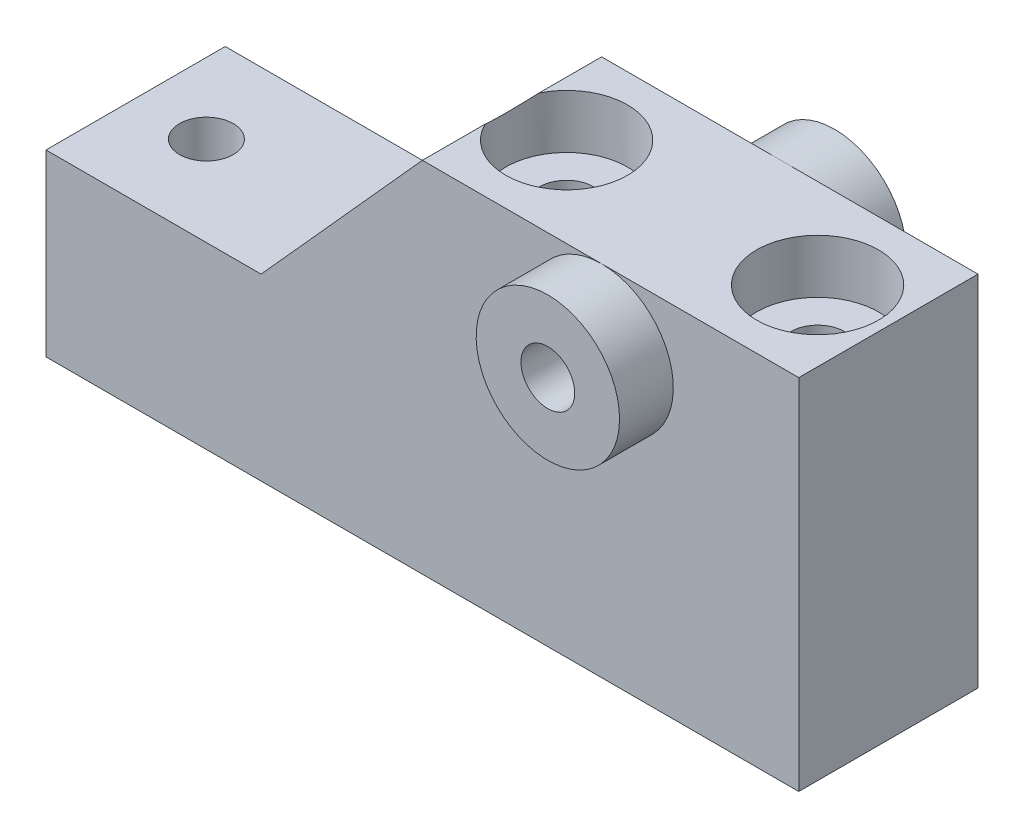
ISO-10303-21;
HEADER;
FILE_DESCRIPTION(('STEP AP214'),'2;1');
FILE_NAME('part.step','',(''),(''),'','','');
FILE_SCHEMA(('AUTOMOTIVE_DESIGN { 1 0 10303 214 1 1 1 1 }'));
ENDSEC;
DATA;
#1=APPLICATION_CONTEXT('core data for automotive mechanical design processes');
#2=APPLICATION_PROTOCOL_DEFINITION('international standard','automotive_design',2000,#1);
#3=PRODUCT_CONTEXT('',#1,'mechanical');
#4=PRODUCT('Part','Part','',(#3));
#5=PRODUCT_RELATED_PRODUCT_CATEGORY('part','',(#4));
#6=PRODUCT_DEFINITION_FORMATION('','',#4);
#7=PRODUCT_DEFINITION_CONTEXT('part definition',#1,'design');
#8=PRODUCT_DEFINITION('design','',#6,#7);
#9=PRODUCT_DEFINITION_SHAPE('','',#8);
#10=(LENGTH_UNIT() NAMED_UNIT(*) SI_UNIT(.MILLI.,.METRE.));
#11=(NAMED_UNIT(*) PLANE_ANGLE_UNIT() SI_UNIT($,.RADIAN.));
#12=(NAMED_UNIT(*) SI_UNIT($,.STERADIAN.) SOLID_ANGLE_UNIT());
#13=UNCERTAINTY_MEASURE_WITH_UNIT(LENGTH_MEASURE(1.E-05),#10,'distance_accuracy_value','');
#14=(GEOMETRIC_REPRESENTATION_CONTEXT(3) GLOBAL_UNCERTAINTY_ASSIGNED_CONTEXT((#13)) GLOBAL_UNIT_ASSIGNED_CONTEXT((#10,
#11,#12)) REPRESENTATION_CONTEXT('',''));
#15=CARTESIAN_POINT('',(0.,0.,0.));
#16=DIRECTION('',(0.,0.,1.));
#17=DIRECTION('',(1.,0.,0.));
#18=AXIS2_PLACEMENT_3D('',#15,#16,#17);
#19=CARTESIAN_POINT('',(38.05,28.,5.));
#20=DIRECTION('',(0.,-1.,0.));
#21=DIRECTION('',(0.,0.,-1.));
#22=AXIS2_PLACEMENT_3D('',#19,#20,#21);
#23=CYLINDRICAL_SURFACE('',#22,1.5);
#24=CARTESIAN_POINT('',(38.05,0.,5.));
#25=DIRECTION('',(0.,-1.,0.));
#26=DIRECTION('',(0.,0.,-1.));
#27=AXIS2_PLACEMENT_3D('',#24,#25,#26);
#28=CIRCLE('',#27,1.5);
#29=CARTESIAN_POINT('',(38.05,0.,3.5));
#30=VERTEX_POINT('',#29);
#31=EDGE_CURVE('E135',#30,#30,#28,.T.);
#32=ORIENTED_EDGE('',*,*,#31,.T.);
#33=EDGE_LOOP('',(#32));
#34=FACE_BOUND('',#33,.T.);
#35=CARTESIAN_POINT('',(38.05,17.,5.));
#36=DIRECTION('',(0.,1.,0.));
#37=DIRECTION('',(0.,0.,1.));
#38=AXIS2_PLACEMENT_3D('',#35,#36,#37);
#39=CIRCLE('',#38,1.5);
#40=CARTESIAN_POINT('',(38.05,17.,6.5));
#41=VERTEX_POINT('',#40);
#42=EDGE_CURVE('E36',#41,#41,#39,.F.);
#43=ORIENTED_EDGE('',*,*,#42,.F.);
#44=EDGE_LOOP('',(#43));
#45=FACE_BOUND('',#44,.T.);
#46=ADVANCED_FACE('F32',(#34,#45),#23,.F.);
#47=CARTESIAN_POINT('',(24.05,28.,5.));
#48=DIRECTION('',(0.,-1.,0.));
#49=DIRECTION('',(0.,0.,-1.));
#50=AXIS2_PLACEMENT_3D('',#47,#48,#49);
#51=CYLINDRICAL_SURFACE('',#50,1.5);
#52=CARTESIAN_POINT('',(24.05,0.,5.));
#53=DIRECTION('',(0.,-1.,0.));
#54=DIRECTION('',(0.,0.,-1.));
#55=AXIS2_PLACEMENT_3D('',#52,#53,#54);
#56=CIRCLE('',#55,1.5);
#57=CARTESIAN_POINT('',(24.05,0.,3.5));
#58=VERTEX_POINT('',#57);
#59=EDGE_CURVE('E161',#58,#58,#56,.T.);
#60=ORIENTED_EDGE('',*,*,#59,.T.);
#61=EDGE_LOOP('',(#60));
#62=FACE_BOUND('',#61,.T.);
#63=CARTESIAN_POINT('',(24.05,17.,5.));
#64=DIRECTION('',(0.,1.,0.));
#65=DIRECTION('',(0.,0.,1.));
#66=AXIS2_PLACEMENT_3D('',#63,#64,#65);
#67=CIRCLE('',#66,1.5);
#68=CARTESIAN_POINT('',(24.05,17.,6.5));
#69=VERTEX_POINT('',#68);
#70=EDGE_CURVE('E159',#69,#69,#67,.F.);
#71=ORIENTED_EDGE('',*,*,#70,.F.);
#72=EDGE_LOOP('',(#71));
#73=FACE_BOUND('',#72,.T.);
#74=ADVANCED_FACE('F232',(#62,#73),#51,.F.);
#75=CARTESIAN_POINT('',(0.,0.,10.));
#76=DIRECTION('',(0.,0.,1.));
#77=DIRECTION('',(1.,0.,0.));
#78=AXIS2_PLACEMENT_3D('',#75,#76,#77);
#79=PLANE('',#78);
#80=DIRECTION('',(-1.,0.,0.));
#81=VECTOR('',#80,1.);
#82=CARTESIAN_POINT('',(21.,20.,10.));
#83=LINE('',#82,#81);
#84=CARTESIAN_POINT('',(42.,20.,10.));
#85=VERTEX_POINT('',#84);
#86=CARTESIAN_POINT('',(31.,20.,10.));
#87=VERTEX_POINT('',#86);
#88=EDGE_CURVE('E113',#85,#87,#83,.T.);
#89=ORIENTED_EDGE('',*,*,#88,.T.);
#90=CARTESIAN_POINT('',(31.,16.,10.));
#91=DIRECTION('',(0.,0.,1.));
#92=DIRECTION('',(1.,0.,0.));
#93=AXIS2_PLACEMENT_3D('',#90,#91,#92);
#94=CIRCLE('',#93,4.00000000000001);
#95=EDGE_CURVE('E110',#87,#87,#94,.T.);
#96=ORIENTED_EDGE('',*,*,#95,.F.);
#97=CARTESIAN_POINT('',(21.,20.,10.));
#98=VERTEX_POINT('',#97);
#99=EDGE_CURVE('E101',#87,#98,#83,.T.);
#100=ORIENTED_EDGE('',*,*,#99,.T.);
#101=DIRECTION('',(-0.66896473162245,-0.743294146247166,0.));
#102=VECTOR('',#101,1.);
#103=CARTESIAN_POINT('',(12.,10.,10.));
#104=LINE('',#103,#102);
#105=CARTESIAN_POINT('',(12.,10.,10.));
#106=VERTEX_POINT('',#105);
#107=EDGE_CURVE('E106',#98,#106,#104,.T.);
#108=ORIENTED_EDGE('',*,*,#107,.T.);
#109=DIRECTION('',(-1.,0.,0.));
#110=VECTOR('',#109,1.);
#111=CARTESIAN_POINT('',(0.,10.,10.));
#112=LINE('',#111,#110);
#113=CARTESIAN_POINT('',(0.,10.,10.));
#114=VERTEX_POINT('',#113);
#115=EDGE_CURVE('E55',#106,#114,#112,.T.);
#116=ORIENTED_EDGE('',*,*,#115,.T.);
#117=DIRECTION('',(0.,-1.,0.));
#118=VECTOR('',#117,1.);
#119=CARTESIAN_POINT('',(0.,10.,10.));
#120=LINE('',#119,#118);
#121=CARTESIAN_POINT('',(0.,0.,10.));
#122=VERTEX_POINT('',#121);
#123=EDGE_CURVE('E146',#114,#122,#120,.T.);
#124=ORIENTED_EDGE('',*,*,#123,.T.);
#125=DIRECTION('',(1.,0.,0.));
#126=VECTOR('',#125,1.);
#127=CARTESIAN_POINT('',(0.,0.,10.));
#128=LINE('',#127,#126);
#129=CARTESIAN_POINT('',(42.,0.,10.));
#130=VERTEX_POINT('',#129);
#131=EDGE_CURVE('E91',#122,#130,#128,.T.);
#132=ORIENTED_EDGE('',*,*,#131,.T.);
#133=DIRECTION('',(0.,1.,0.));
#134=VECTOR('',#133,1.);
#135=CARTESIAN_POINT('',(42.,0.,10.));
#136=LINE('',#135,#134);
#137=EDGE_CURVE('E114',#130,#85,#136,.T.);
#138=ORIENTED_EDGE('',*,*,#137,.T.);
#139=EDGE_LOOP('',(#89,#96,#100,#108,#116,#124,#132,#138));
#140=FACE_BOUND('',#139,.T.);
#141=ADVANCED_FACE('F104',(#140),#79,.T.);
#142=CARTESIAN_POINT('',(0.,0.,0.));
#143=DIRECTION('',(0.,0.,1.));
#144=DIRECTION('',(1.,0.,0.));
#145=AXIS2_PLACEMENT_3D('',#142,#143,#144);
#146=PLANE('',#145);
#147=DIRECTION('',(-1.,0.,0.));
#148=VECTOR('',#147,1.);
#149=CARTESIAN_POINT('',(21.,20.,0.));
#150=LINE('',#149,#148);
#151=CARTESIAN_POINT('',(31.,20.,0.));
#152=VERTEX_POINT('',#151);
#153=CARTESIAN_POINT('',(21.,20.,0.));
#154=VERTEX_POINT('',#153);
#155=EDGE_CURVE('E139',#152,#154,#150,.T.);
#156=ORIENTED_EDGE('',*,*,#155,.F.);
#157=CARTESIAN_POINT('',(31.,16.,0.));
#158=DIRECTION('',(0.,0.,-1.));
#159=DIRECTION('',(-1.,0.,0.));
#160=AXIS2_PLACEMENT_3D('',#157,#158,#159);
#161=CIRCLE('',#160,4.);
#162=EDGE_CURVE('E193',#152,#152,#161,.T.);
#163=ORIENTED_EDGE('',*,*,#162,.F.);
#164=CARTESIAN_POINT('',(42.,20.,0.));
#165=VERTEX_POINT('',#164);
#166=EDGE_CURVE('E140',#165,#152,#150,.T.);
#167=ORIENTED_EDGE('',*,*,#166,.F.);
#168=DIRECTION('',(0.,1.,0.));
#169=VECTOR('',#168,1.);
#170=CARTESIAN_POINT('',(42.,0.,0.));
#171=LINE('',#170,#169);
#172=CARTESIAN_POINT('',(42.,0.,0.));
#173=VERTEX_POINT('',#172);
#174=EDGE_CURVE('E137',#173,#165,#171,.T.);
#175=ORIENTED_EDGE('',*,*,#174,.F.);
#176=DIRECTION('',(1.,0.,0.));
#177=VECTOR('',#176,1.);
#178=CARTESIAN_POINT('',(0.,0.,0.));
#179=LINE('',#178,#177);
#180=CARTESIAN_POINT('',(0.,0.,0.));
#181=VERTEX_POINT('',#180);
#182=EDGE_CURVE('E134',#181,#173,#179,.T.);
#183=ORIENTED_EDGE('',*,*,#182,.F.);
#184=DIRECTION('',(0.,-1.,0.));
#185=VECTOR('',#184,1.);
#186=CARTESIAN_POINT('',(0.,10.,0.));
#187=LINE('',#186,#185);
#188=CARTESIAN_POINT('',(0.,10.,0.));
#189=VERTEX_POINT('',#188);
#190=EDGE_CURVE('E131',#189,#181,#187,.T.);
#191=ORIENTED_EDGE('',*,*,#190,.F.);
#192=DIRECTION('',(-1.,0.,0.));
#193=VECTOR('',#192,1.);
#194=CARTESIAN_POINT('',(0.,10.,0.));
#195=LINE('',#194,#193);
#196=CARTESIAN_POINT('',(12.,10.,0.));
#197=VERTEX_POINT('',#196);
#198=EDGE_CURVE('E82',#197,#189,#195,.T.);
#199=ORIENTED_EDGE('',*,*,#198,.F.);
#200=DIRECTION('',(-0.66896473162245,-0.743294146247166,0.));
#201=VECTOR('',#200,1.);
#202=CARTESIAN_POINT('',(12.,10.,0.));
#203=LINE('',#202,#201);
#204=EDGE_CURVE('E143',#154,#197,#203,.T.);
#205=ORIENTED_EDGE('',*,*,#204,.F.);
#206=EDGE_LOOP('',(#156,#163,#167,#175,#183,#191,#199,#205));
#207=FACE_BOUND('',#206,.T.);
#208=ADVANCED_FACE('F191',(#207),#146,.F.);
#209=CARTESIAN_POINT('',(0.,10.,10.));
#210=DIRECTION('',(1.,0.,0.));
#211=DIRECTION('',(0.,0.,-1.));
#212=AXIS2_PLACEMENT_3D('',#209,#210,#211);
#213=PLANE('',#212);
#214=ORIENTED_EDGE('',*,*,#190,.T.);
#215=DIRECTION('',(0.,0.,-1.));
#216=VECTOR('',#215,1.);
#217=CARTESIAN_POINT('',(0.,0.,10.));
#218=LINE('',#217,#216);
#219=EDGE_CURVE('E41',#122,#181,#218,.T.);
#220=ORIENTED_EDGE('',*,*,#219,.F.);
#221=ORIENTED_EDGE('',*,*,#123,.F.);
#222=DIRECTION('',(0.,0.,-1.));
#223=VECTOR('',#222,1.);
#224=CARTESIAN_POINT('',(0.,10.,10.));
#225=LINE('',#224,#223);
#226=EDGE_CURVE('E127',#114,#189,#225,.T.);
#227=ORIENTED_EDGE('',*,*,#226,.T.);
#228=EDGE_LOOP('',(#214,#220,#221,#227));
#229=FACE_BOUND('',#228,.T.);
#230=ADVANCED_FACE('F34',(#229),#213,.F.);
#231=CARTESIAN_POINT('',(0.,0.,10.));
#232=DIRECTION('',(0.,1.,0.));
#233=DIRECTION('',(0.,0.,1.));
#234=AXIS2_PLACEMENT_3D('',#231,#232,#233);
#235=PLANE('',#234);
#236=CARTESIAN_POINT('',(3.95000000000001,0.,5.));
#237=DIRECTION('',(0.,-1.,0.));
#238=DIRECTION('',(0.,0.,-1.));
#239=AXIS2_PLACEMENT_3D('',#236,#237,#238);
#240=CIRCLE('',#239,1.5);
#241=CARTESIAN_POINT('',(3.95000000000001,0.,3.5));
#242=VERTEX_POINT('',#241);
#243=EDGE_CURVE('E158',#242,#242,#240,.T.);
#244=ORIENTED_EDGE('',*,*,#243,.F.);
#245=EDGE_LOOP('',(#244));
#246=FACE_BOUND('',#245,.T.);
#247=ORIENTED_EDGE('',*,*,#59,.F.);
#248=EDGE_LOOP('',(#247));
#249=FACE_BOUND('',#248,.T.);
#250=ORIENTED_EDGE('',*,*,#31,.F.);
#251=EDGE_LOOP('',(#250));
#252=FACE_BOUND('',#251,.T.);
#253=ORIENTED_EDGE('',*,*,#182,.T.);
#254=DIRECTION('',(0.,0.,-1.));
#255=VECTOR('',#254,1.);
#256=CARTESIAN_POINT('',(42.,0.,10.));
#257=LINE('',#256,#255);
#258=EDGE_CURVE('E151',#130,#173,#257,.T.);
#259=ORIENTED_EDGE('',*,*,#258,.F.);
#260=ORIENTED_EDGE('',*,*,#131,.F.);
#261=ORIENTED_EDGE('',*,*,#219,.T.);
#262=EDGE_LOOP('',(#253,#259,#260,#261));
#263=FACE_BOUND('',#262,.T.);
#264=ADVANCED_FACE('F229',(#246,#249,#252,#263),#235,.F.);
#265=CARTESIAN_POINT('',(42.,0.,10.));
#266=DIRECTION('',(-1.,0.,0.));
#267=DIRECTION('',(0.,0.,1.));
#268=AXIS2_PLACEMENT_3D('',#265,#266,#267);
#269=PLANE('',#268);
#270=ORIENTED_EDGE('',*,*,#174,.T.);
#271=DIRECTION('',(0.,0.,-1.));
#272=VECTOR('',#271,1.);
#273=CARTESIAN_POINT('',(42.,20.,10.));
#274=LINE('',#273,#272);
#275=EDGE_CURVE('E121',#85,#165,#274,.T.);
#276=ORIENTED_EDGE('',*,*,#275,.F.);
#277=ORIENTED_EDGE('',*,*,#137,.F.);
#278=ORIENTED_EDGE('',*,*,#258,.T.);
#279=EDGE_LOOP('',(#270,#276,#277,#278));
#280=FACE_BOUND('',#279,.T.);
#281=ADVANCED_FACE('F184',(#280),#269,.F.);
#282=CARTESIAN_POINT('',(21.,20.,10.));
#283=DIRECTION('',(0.,-1.,0.));
#284=DIRECTION('',(0.,0.,-1.));
#285=AXIS2_PLACEMENT_3D('',#282,#283,#284);
#286=PLANE('',#285);
#287=CARTESIAN_POINT('',(38.05,20.,5.));
#288=DIRECTION('',(0.,1.,0.));
#289=DIRECTION('',(0.,0.,1.));
#290=AXIS2_PLACEMENT_3D('',#287,#288,#289);
#291=CIRCLE('',#290,3.4);
#292=CARTESIAN_POINT('',(38.05,20.,8.4));
#293=VERTEX_POINT('',#292);
#294=EDGE_CURVE('E173',#293,#293,#291,.T.);
#295=ORIENTED_EDGE('',*,*,#294,.F.);
#296=EDGE_LOOP('',(#295));
#297=FACE_BOUND('',#296,.T.);
#298=DIRECTION('',(0.,0.,-1.));
#299=VECTOR('',#298,1.);
#300=CARTESIAN_POINT('',(21.,20.,10.));
#301=LINE('',#300,#299);
#302=CARTESIAN_POINT('',(21.,20.,3.49750207986835));
#303=VERTEX_POINT('',#302);
#304=EDGE_CURVE('E122',#303,#154,#301,.T.);
#305=ORIENTED_EDGE('',*,*,#304,.F.);
#306=CARTESIAN_POINT('',(24.05,20.,5.));
#307=DIRECTION('',(0.,1.,0.));
#308=DIRECTION('',(0.,0.,1.));
#309=AXIS2_PLACEMENT_3D('',#306,#307,#308);
#310=CIRCLE('',#309,3.4);
#311=CARTESIAN_POINT('',(21.,20.,6.50249792013165));
#312=VERTEX_POINT('',#311);
#313=EDGE_CURVE('E47',#312,#303,#310,.T.);
#314=ORIENTED_EDGE('',*,*,#313,.F.);
#315=EDGE_CURVE('E117',#98,#312,#301,.T.);
#316=ORIENTED_EDGE('',*,*,#315,.F.);
#317=ORIENTED_EDGE('',*,*,#99,.F.);
#318=ORIENTED_EDGE('',*,*,#88,.F.);
#319=ORIENTED_EDGE('',*,*,#275,.T.);
#320=ORIENTED_EDGE('',*,*,#166,.T.);
#321=ORIENTED_EDGE('',*,*,#155,.T.);
#322=EDGE_LOOP('',(#305,#314,#316,#317,#318,#319,#320,#321));
#323=FACE_BOUND('',#322,.T.);
#324=ADVANCED_FACE('F119',(#297,#323),#286,.F.);
#325=CARTESIAN_POINT('',(12.,10.,10.));
#326=DIRECTION('',(0.743294146247166,-0.66896473162245,0.));
#327=DIRECTION('',(0.66896473162245,0.743294146247166,0.));
#328=AXIS2_PLACEMENT_3D('',#325,#326,#327);
#329=PLANE('',#328);
#330=ORIENTED_EDGE('',*,*,#315,.T.);
#331=CARTESIAN_POINT('',(24.05,23.3888888888889,5.));
#332=DIRECTION('',(0.743294146247166,-0.66896473162245,0.));
#333=DIRECTION('',(0.66896473162245,0.743294146247166,0.));
#334=AXIS2_PLACEMENT_3D('',#331,#332,#333);
#335=ELLIPSE('',#334,5.08248019556118,3.4);
#336=EDGE_CURVE('E11',#312,#303,#335,.T.);
#337=ORIENTED_EDGE('',*,*,#336,.T.);
#338=ORIENTED_EDGE('',*,*,#304,.T.);
#339=ORIENTED_EDGE('',*,*,#204,.T.);
#340=DIRECTION('',(0.,0.,-1.));
#341=VECTOR('',#340,1.);
#342=CARTESIAN_POINT('',(12.,10.,10.));
#343=LINE('',#342,#341);
#344=EDGE_CURVE('E125',#106,#197,#343,.T.);
#345=ORIENTED_EDGE('',*,*,#344,.F.);
#346=ORIENTED_EDGE('',*,*,#107,.F.);
#347=EDGE_LOOP('',(#330,#337,#338,#339,#345,#346));
#348=FACE_BOUND('',#347,.T.);
#349=ADVANCED_FACE('F124',(#348),#329,.F.);
#350=CARTESIAN_POINT('',(0.,10.,10.));
#351=DIRECTION('',(0.,-1.,0.));
#352=DIRECTION('',(0.,0.,-1.));
#353=AXIS2_PLACEMENT_3D('',#350,#351,#352);
#354=PLANE('',#353);
#355=CARTESIAN_POINT('',(3.95000000000001,10.,5.));
#356=DIRECTION('',(0.,-1.,0.));
#357=DIRECTION('',(0.,0.,-1.));
#358=AXIS2_PLACEMENT_3D('',#355,#356,#357);
#359=CIRCLE('',#358,1.5);
#360=CARTESIAN_POINT('',(3.95000000000001,10.,3.5));
#361=VERTEX_POINT('',#360);
#362=EDGE_CURVE('E155',#361,#361,#359,.T.);
#363=ORIENTED_EDGE('',*,*,#362,.T.);
#364=EDGE_LOOP('',(#363));
#365=FACE_BOUND('',#364,.T.);
#366=ORIENTED_EDGE('',*,*,#198,.T.);
#367=ORIENTED_EDGE('',*,*,#226,.F.);
#368=ORIENTED_EDGE('',*,*,#115,.F.);
#369=ORIENTED_EDGE('',*,*,#344,.T.);
#370=EDGE_LOOP('',(#366,#367,#368,#369));
#371=FACE_BOUND('',#370,.T.);
#372=ADVANCED_FACE('F227',(#365,#371),#354,.F.);
#373=CARTESIAN_POINT('',(31.,16.,10.));
#374=DIRECTION('',(0.,0.,-1.));
#375=DIRECTION('',(-1.,0.,0.));
#376=AXIS2_PLACEMENT_3D('',#373,#374,#375);
#377=CYLINDRICAL_SURFACE('',#376,1.5);
#378=CARTESIAN_POINT('',(31.,16.,13.));
#379=DIRECTION('',(0.,0.,1.));
#380=DIRECTION('',(1.,0.,0.));
#381=AXIS2_PLACEMENT_3D('',#378,#379,#380);
#382=CIRCLE('',#381,1.5);
#383=CARTESIAN_POINT('',(32.5,16.,13.));
#384=VERTEX_POINT('',#383);
#385=EDGE_CURVE('E201',#384,#384,#382,.T.);
#386=ORIENTED_EDGE('',*,*,#385,.T.);
#387=EDGE_LOOP('',(#386));
#388=FACE_BOUND('',#387,.T.);
#389=CARTESIAN_POINT('',(31.,16.,-3.));
#390=DIRECTION('',(0.,0.,-1.));
#391=DIRECTION('',(-1.,0.,0.));
#392=AXIS2_PLACEMENT_3D('',#389,#390,#391);
#393=CIRCLE('',#392,1.5);
#394=CARTESIAN_POINT('',(29.5,16.,-3.));
#395=VERTEX_POINT('',#394);
#396=EDGE_CURVE('E198',#395,#395,#393,.T.);
#397=ORIENTED_EDGE('',*,*,#396,.T.);
#398=EDGE_LOOP('',(#397));
#399=FACE_BOUND('',#398,.T.);
#400=ADVANCED_FACE('F243',(#388,#399),#377,.F.);
#401=CARTESIAN_POINT('',(3.95000000000001,28.,5.));
#402=DIRECTION('',(0.,-1.,0.));
#403=DIRECTION('',(0.,0.,-1.));
#404=AXIS2_PLACEMENT_3D('',#401,#402,#403);
#405=CYLINDRICAL_SURFACE('',#404,1.5);
#406=ORIENTED_EDGE('',*,*,#243,.T.);
#407=EDGE_LOOP('',(#406));
#408=FACE_BOUND('',#407,.T.);
#409=ORIENTED_EDGE('',*,*,#362,.F.);
#410=EDGE_LOOP('',(#409));
#411=FACE_BOUND('',#410,.T.);
#412=ADVANCED_FACE('F246',(#408,#411),#405,.F.);
#413=CARTESIAN_POINT('',(24.05,17.,5.));
#414=DIRECTION('',(0.,1.,0.));
#415=DIRECTION('',(0.,0.,1.));
#416=AXIS2_PLACEMENT_3D('',#413,#414,#415);
#417=CYLINDRICAL_SURFACE('',#416,3.4);
#418=CARTESIAN_POINT('',(24.05,17.,5.));
#419=DIRECTION('',(0.,1.,0.));
#420=DIRECTION('',(0.,0.,1.));
#421=AXIS2_PLACEMENT_3D('',#418,#419,#420);
#422=CIRCLE('',#421,3.4);
#423=CARTESIAN_POINT('',(24.05,17.,8.4));
#424=VERTEX_POINT('',#423);
#425=EDGE_CURVE('E162',#424,#424,#422,.T.);
#426=ORIENTED_EDGE('',*,*,#425,.F.);
#427=EDGE_LOOP('',(#426));
#428=FACE_BOUND('',#427,.T.);
#429=ORIENTED_EDGE('',*,*,#313,.T.);
#430=ORIENTED_EDGE('',*,*,#336,.F.);
#431=EDGE_LOOP('',(#429,#430));
#432=FACE_BOUND('',#431,.T.);
#433=ADVANCED_FACE('F259',(#428,#432),#417,.F.);
#434=CARTESIAN_POINT('',(24.05,17.,5.));
#435=DIRECTION('',(0.,1.,0.));
#436=DIRECTION('',(0.,0.,1.));
#437=AXIS2_PLACEMENT_3D('',#434,#435,#436);
#438=PLANE('',#437);
#439=ORIENTED_EDGE('',*,*,#425,.T.);
#440=EDGE_LOOP('',(#439));
#441=FACE_BOUND('',#440,.T.);
#442=ORIENTED_EDGE('',*,*,#70,.T.);
#443=EDGE_LOOP('',(#442));
#444=FACE_BOUND('',#443,.T.);
#445=ADVANCED_FACE('F264',(#441,#444),#438,.T.);
#446=CARTESIAN_POINT('',(38.05,17.,5.));
#447=DIRECTION('',(0.,1.,0.));
#448=DIRECTION('',(0.,0.,1.));
#449=AXIS2_PLACEMENT_3D('',#446,#447,#448);
#450=PLANE('',#449);
#451=CARTESIAN_POINT('',(38.05,17.,5.));
#452=DIRECTION('',(0.,1.,0.));
#453=DIRECTION('',(0.,0.,1.));
#454=AXIS2_PLACEMENT_3D('',#451,#452,#453);
#455=CIRCLE('',#454,3.4);
#456=CARTESIAN_POINT('',(38.05,17.,8.4));
#457=VERTEX_POINT('',#456);
#458=EDGE_CURVE('E211',#457,#457,#455,.T.);
#459=ORIENTED_EDGE('',*,*,#458,.T.);
#460=EDGE_LOOP('',(#459));
#461=FACE_BOUND('',#460,.T.);
#462=ORIENTED_EDGE('',*,*,#42,.T.);
#463=EDGE_LOOP('',(#462));
#464=FACE_BOUND('',#463,.T.);
#465=ADVANCED_FACE('F270',(#461,#464),#450,.T.);
#466=CARTESIAN_POINT('',(38.05,17.,5.));
#467=DIRECTION('',(0.,1.,0.));
#468=DIRECTION('',(0.,0.,1.));
#469=AXIS2_PLACEMENT_3D('',#466,#467,#468);
#470=CYLINDRICAL_SURFACE('',#469,3.4);
#471=ORIENTED_EDGE('',*,*,#458,.F.);
#472=EDGE_LOOP('',(#471));
#473=FACE_BOUND('',#472,.T.);
#474=ORIENTED_EDGE('',*,*,#294,.T.);
#475=EDGE_LOOP('',(#474));
#476=FACE_BOUND('',#475,.T.);
#477=ADVANCED_FACE('F219',(#473,#476),#470,.F.);
#478=CARTESIAN_POINT('',(31.,16.,13.));
#479=DIRECTION('',(0.,0.,1.));
#480=DIRECTION('',(1.,0.,0.));
#481=AXIS2_PLACEMENT_3D('',#478,#479,#480);
#482=PLANE('',#481);
#483=CARTESIAN_POINT('',(31.,16.,13.));
#484=DIRECTION('',(0.,0.,1.));
#485=DIRECTION('',(1.,0.,0.));
#486=AXIS2_PLACEMENT_3D('',#483,#484,#485);
#487=CIRCLE('',#486,4.00000000000001);
#488=CARTESIAN_POINT('',(35.,16.,13.));
#489=VERTEX_POINT('',#488);
#490=EDGE_CURVE('E208',#489,#489,#487,.T.);
#491=ORIENTED_EDGE('',*,*,#490,.T.);
#492=EDGE_LOOP('',(#491));
#493=FACE_BOUND('',#492,.T.);
#494=ORIENTED_EDGE('',*,*,#385,.F.);
#495=EDGE_LOOP('',(#494));
#496=FACE_BOUND('',#495,.T.);
#497=ADVANCED_FACE('F273',(#493,#496),#482,.T.);
#498=CARTESIAN_POINT('',(31.,16.,13.));
#499=DIRECTION('',(0.,0.,-1.));
#500=DIRECTION('',(-1.,0.,0.));
#501=AXIS2_PLACEMENT_3D('',#498,#499,#500);
#502=CYLINDRICAL_SURFACE('',#501,4.00000000000001);
#503=ORIENTED_EDGE('',*,*,#490,.F.);
#504=EDGE_LOOP('',(#503));
#505=FACE_BOUND('',#504,.T.);
#506=ORIENTED_EDGE('',*,*,#95,.T.);
#507=EDGE_LOOP('',(#506));
#508=FACE_BOUND('',#507,.T.);
#509=ADVANCED_FACE('F277',(#505,#508),#502,.T.);
#510=CARTESIAN_POINT('',(31.,16.,-3.));
#511=DIRECTION('',(0.,0.,-1.));
#512=DIRECTION('',(-1.,0.,0.));
#513=AXIS2_PLACEMENT_3D('',#510,#511,#512);
#514=PLANE('',#513);
#515=CARTESIAN_POINT('',(31.,16.,-3.));
#516=DIRECTION('',(0.,0.,-1.));
#517=DIRECTION('',(-1.,0.,0.));
#518=AXIS2_PLACEMENT_3D('',#515,#516,#517);
#519=CIRCLE('',#518,4.);
#520=CARTESIAN_POINT('',(27.,16.,-3.));
#521=VERTEX_POINT('',#520);
#522=EDGE_CURVE('E197',#521,#521,#519,.T.);
#523=ORIENTED_EDGE('',*,*,#522,.T.);
#524=EDGE_LOOP('',(#523));
#525=FACE_BOUND('',#524,.T.);
#526=ORIENTED_EDGE('',*,*,#396,.F.);
#527=EDGE_LOOP('',(#526));
#528=FACE_BOUND('',#527,.T.);
#529=ADVANCED_FACE('F280',(#525,#528),#514,.T.);
#530=CARTESIAN_POINT('',(31.,16.,-3.));
#531=DIRECTION('',(0.,0.,1.));
#532=DIRECTION('',(1.,0.,0.));
#533=AXIS2_PLACEMENT_3D('',#530,#531,#532);
#534=CYLINDRICAL_SURFACE('',#533,4.);
#535=ORIENTED_EDGE('',*,*,#522,.F.);
#536=EDGE_LOOP('',(#535));
#537=FACE_BOUND('',#536,.T.);
#538=ORIENTED_EDGE('',*,*,#162,.T.);
#539=EDGE_LOOP('',(#538));
#540=FACE_BOUND('',#539,.T.);
#541=ADVANCED_FACE('F285',(#537,#540),#534,.T.);
#542=CLOSED_SHELL('',(#46,#74,#141,#208,#230,#264,#281,#324,#349,#372,#400,#412,#433,#445,#465,
#477,#497,#509,#529,#541));
#543=MANIFOLD_SOLID_BREP('B2',#542);
#544=ADVANCED_BREP_SHAPE_REPRESENTATION('',(#18,#543),#14);
#545=SHAPE_DEFINITION_REPRESENTATION(#9,#544);
ENDSEC;
END-ISO-10303-21;
